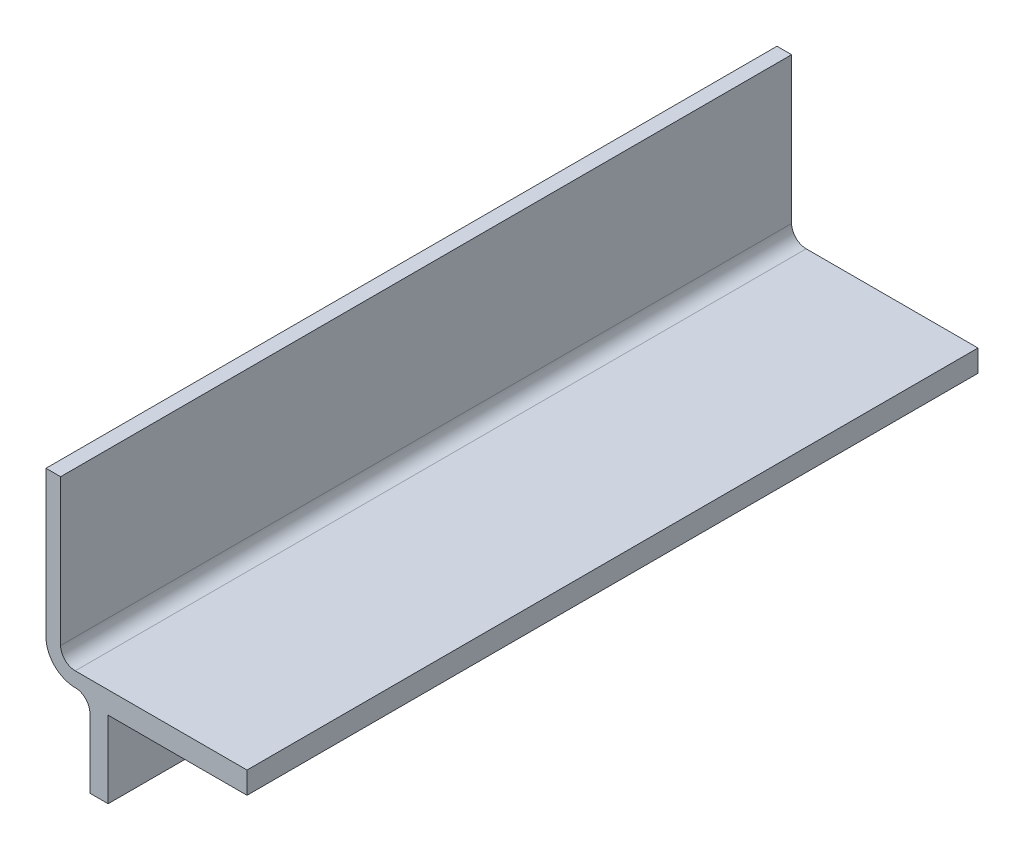
ISO-10303-21;
HEADER;
FILE_DESCRIPTION(('STEP AP214'),'2;1');
FILE_NAME('part.step','',(''),(''),'','','');
FILE_SCHEMA(('AUTOMOTIVE_DESIGN { 1 0 10303 214 1 1 1 1 }'));
ENDSEC;
DATA;
#1=APPLICATION_CONTEXT('core data for automotive mechanical design processes');
#2=APPLICATION_PROTOCOL_DEFINITION('international standard','automotive_design',2000,#1);
#3=PRODUCT_CONTEXT('',#1,'mechanical');
#4=PRODUCT('Part','Part','',(#3));
#5=PRODUCT_RELATED_PRODUCT_CATEGORY('part','',(#4));
#6=PRODUCT_DEFINITION_FORMATION('','',#4);
#7=PRODUCT_DEFINITION_CONTEXT('part definition',#1,'design');
#8=PRODUCT_DEFINITION('design','',#6,#7);
#9=PRODUCT_DEFINITION_SHAPE('','',#8);
#10=(LENGTH_UNIT() NAMED_UNIT(*) SI_UNIT(.MILLI.,.METRE.));
#11=(NAMED_UNIT(*) PLANE_ANGLE_UNIT() SI_UNIT($,.RADIAN.));
#12=(NAMED_UNIT(*) SI_UNIT($,.STERADIAN.) SOLID_ANGLE_UNIT());
#13=UNCERTAINTY_MEASURE_WITH_UNIT(LENGTH_MEASURE(1.E-05),#10,'distance_accuracy_value','');
#14=(GEOMETRIC_REPRESENTATION_CONTEXT(3) GLOBAL_UNCERTAINTY_ASSIGNED_CONTEXT((#13)) GLOBAL_UNIT_ASSIGNED_CONTEXT((#10,
#11,#12)) REPRESENTATION_CONTEXT('',''));
#15=CARTESIAN_POINT('',(0.,0.,0.));
#16=DIRECTION('',(0.,0.,1.));
#17=DIRECTION('',(1.,0.,0.));
#18=AXIS2_PLACEMENT_3D('',#15,#16,#17);
#19=CARTESIAN_POINT('',(-2.5,0.,100.));
#20=DIRECTION('',(1.,0.,0.));
#21=DIRECTION('',(0.,0.,-1.));
#22=AXIS2_PLACEMENT_3D('',#19,#20,#21);
#23=PLANE('',#22);
#24=DIRECTION('',(0.,0.,-1.));
#25=VECTOR('',#24,1.);
#26=CARTESIAN_POINT('',(-2.5,0.,100.));
#27=LINE('',#26,#25);
#28=CARTESIAN_POINT('',(-2.5,0.,83.643534003375));
#29=VERTEX_POINT('',#28);
#30=CARTESIAN_POINT('',(-2.5,0.,16.3564659966251));
#31=VERTEX_POINT('',#30);
#32=EDGE_CURVE('E147',#29,#31,#27,.T.);
#33=ORIENTED_EDGE('',*,*,#32,.F.);
#34=CARTESIAN_POINT('',(-2.5,4.5,85.));
#35=DIRECTION('',(-1.,0.,0.));
#36=DIRECTION('',(0.,0.,1.));
#37=AXIS2_PLACEMENT_3D('',#34,#35,#36);
#38=CIRCLE('',#37,4.7);
#39=CARTESIAN_POINT('',(-2.5,0.,86.3564659966251));
#40=VERTEX_POINT('',#39);
#41=EDGE_CURVE('E54',#40,#29,#38,.T.);
#42=ORIENTED_EDGE('',*,*,#41,.F.);
#43=CARTESIAN_POINT('',(-2.5,0.,100.));
#44=VERTEX_POINT('',#43);
#45=EDGE_CURVE('E145',#44,#40,#27,.T.);
#46=ORIENTED_EDGE('',*,*,#45,.F.);
#47=DIRECTION('',(0.,-1.,0.));
#48=VECTOR('',#47,1.);
#49=CARTESIAN_POINT('',(-2.5,0.,100.));
#50=LINE('',#49,#48);
#51=CARTESIAN_POINT('',(-2.5,9.5,100.));
#52=VERTEX_POINT('',#51);
#53=EDGE_CURVE('E168',#52,#44,#50,.T.);
#54=ORIENTED_EDGE('',*,*,#53,.F.);
#55=DIRECTION('',(0.,0.,-1.));
#56=VECTOR('',#55,1.);
#57=CARTESIAN_POINT('',(-2.5,9.5,0.));
#58=LINE('',#57,#56);
#59=CARTESIAN_POINT('',(-2.5,9.5,0.));
#60=VERTEX_POINT('',#59);
#61=EDGE_CURVE('E331',#52,#60,#58,.T.);
#62=ORIENTED_EDGE('',*,*,#61,.T.);
#63=DIRECTION('',(0.,-1.,0.));
#64=VECTOR('',#63,1.);
#65=CARTESIAN_POINT('',(-2.5,0.,0.));
#66=LINE('',#65,#64);
#67=CARTESIAN_POINT('',(-2.5,0.,0.));
#68=VERTEX_POINT('',#67);
#69=EDGE_CURVE('E174',#60,#68,#66,.T.);
#70=ORIENTED_EDGE('',*,*,#69,.T.);
#71=CARTESIAN_POINT('',(-2.5,0.,13.643534003375));
#72=VERTEX_POINT('',#71);
#73=EDGE_CURVE('E155',#72,#68,#27,.T.);
#74=ORIENTED_EDGE('',*,*,#73,.F.);
#75=CARTESIAN_POINT('',(-2.5,4.5,15.));
#76=DIRECTION('',(-1.,0.,0.));
#77=DIRECTION('',(0.,0.,1.));
#78=AXIS2_PLACEMENT_3D('',#75,#76,#77);
#79=CIRCLE('',#78,4.7);
#80=EDGE_CURVE('E60',#31,#72,#79,.T.);
#81=ORIENTED_EDGE('',*,*,#80,.F.);
#82=EDGE_LOOP('',(#33,#42,#46,#54,#62,#70,#74,#81));
#83=FACE_BOUND('',#82,.T.);
#84=ADVANCED_FACE('F39',(#83),#23,.F.);
#85=CARTESIAN_POINT('',(0.,10.5,100.));
#86=DIRECTION('',(-1.,0.,0.));
#87=DIRECTION('',(0.,-1.,0.));
#88=AXIS2_PLACEMENT_3D('',#85,#86,#87);
#89=PLANE('',#88);
#90=CARTESIAN_POINT('',(0.,4.5,85.));
#91=DIRECTION('',(-1.,0.,0.));
#92=DIRECTION('',(0.,-1.,0.));
#93=AXIS2_PLACEMENT_3D('',#90,#91,#92);
#94=CIRCLE('',#93,2.24999999999998);
#95=CARTESIAN_POINT('',(0.,2.25000000000002,85.));
#96=VERTEX_POINT('',#95);
#97=EDGE_CURVE('E43',#96,#96,#94,.T.);
#98=ORIENTED_EDGE('',*,*,#97,.T.);
#99=EDGE_LOOP('',(#98));
#100=FACE_BOUND('',#99,.T.);
#101=CARTESIAN_POINT('',(0.,4.5,15.));
#102=DIRECTION('',(-1.,0.,0.));
#103=DIRECTION('',(0.,-1.,0.));
#104=AXIS2_PLACEMENT_3D('',#101,#102,#103);
#105=CIRCLE('',#104,2.24999999999998);
#106=CARTESIAN_POINT('',(0.,2.25000000000002,15.));
#107=VERTEX_POINT('',#106);
#108=EDGE_CURVE('E191',#107,#107,#105,.T.);
#109=ORIENTED_EDGE('',*,*,#108,.T.);
#110=EDGE_LOOP('',(#109));
#111=FACE_BOUND('',#110,.T.);
#112=DIRECTION('',(0.,1.,0.));
#113=VECTOR('',#112,1.);
#114=CARTESIAN_POINT('',(0.,10.5,0.));
#115=LINE('',#114,#113);
#116=CARTESIAN_POINT('',(0.,0.,0.));
#117=VERTEX_POINT('',#116);
#118=CARTESIAN_POINT('',(0.,10.5,0.));
#119=VERTEX_POINT('',#118);
#120=EDGE_CURVE('E190',#117,#119,#115,.T.);
#121=ORIENTED_EDGE('',*,*,#120,.T.);
#122=DIRECTION('',(0.,0.,-1.));
#123=VECTOR('',#122,1.);
#124=CARTESIAN_POINT('',(0.,10.5,100.));
#125=LINE('',#124,#123);
#126=CARTESIAN_POINT('',(0.,10.5,100.));
#127=VERTEX_POINT('',#126);
#128=EDGE_CURVE('E334',#127,#119,#125,.T.);
#129=ORIENTED_EDGE('',*,*,#128,.F.);
#130=DIRECTION('',(0.,1.,0.));
#131=VECTOR('',#130,1.);
#132=CARTESIAN_POINT('',(0.,10.5,100.));
#133=LINE('',#132,#131);
#134=CARTESIAN_POINT('',(0.,0.,100.));
#135=VERTEX_POINT('',#134);
#136=EDGE_CURVE('E173',#135,#127,#133,.T.);
#137=ORIENTED_EDGE('',*,*,#136,.F.);
#138=DIRECTION('',(0.,0.,-1.));
#139=VECTOR('',#138,1.);
#140=CARTESIAN_POINT('',(0.,0.,100.));
#141=LINE('',#140,#139);
#142=EDGE_CURVE('E160',#135,#117,#141,.T.);
#143=ORIENTED_EDGE('',*,*,#142,.T.);
#144=EDGE_LOOP('',(#121,#129,#137,#143));
#145=FACE_BOUND('',#144,.T.);
#146=ADVANCED_FACE('F220',(#100,#111,#145),#89,.F.);
#147=CARTESIAN_POINT('',(19.,10.5,100.));
#148=DIRECTION('',(0.,1.,0.));
#149=DIRECTION('',(-1.,0.,0.));
#150=AXIS2_PLACEMENT_3D('',#147,#148,#149);
#151=PLANE('',#150);
#152=DIRECTION('',(1.,0.,0.));
#153=VECTOR('',#152,1.);
#154=CARTESIAN_POINT('',(19.,10.5,0.));
#155=LINE('',#154,#153);
#156=CARTESIAN_POINT('',(19.,10.5,0.));
#157=VERTEX_POINT('',#156);
#158=EDGE_CURVE('E188',#119,#157,#155,.T.);
#159=ORIENTED_EDGE('',*,*,#158,.T.);
#160=DIRECTION('',(0.,0.,-1.));
#161=VECTOR('',#160,1.);
#162=CARTESIAN_POINT('',(19.,10.5,100.));
#163=LINE('',#162,#161);
#164=CARTESIAN_POINT('',(19.,10.5,100.));
#165=VERTEX_POINT('',#164);
#166=EDGE_CURVE('E344',#165,#157,#163,.T.);
#167=ORIENTED_EDGE('',*,*,#166,.F.);
#168=DIRECTION('',(1.,0.,0.));
#169=VECTOR('',#168,1.);
#170=CARTESIAN_POINT('',(19.,10.5,100.));
#171=LINE('',#170,#169);
#172=EDGE_CURVE('E206',#127,#165,#171,.T.);
#173=ORIENTED_EDGE('',*,*,#172,.F.);
#174=ORIENTED_EDGE('',*,*,#128,.T.);
#175=EDGE_LOOP('',(#159,#167,#173,#174));
#176=FACE_BOUND('',#175,.T.);
#177=ADVANCED_FACE('F241',(#176),#151,.F.);
#178=CARTESIAN_POINT('',(19.,13.5,100.));
#179=DIRECTION('',(-1.,0.,0.));
#180=DIRECTION('',(0.,-1.,0.));
#181=AXIS2_PLACEMENT_3D('',#178,#179,#180);
#182=PLANE('',#181);
#183=DIRECTION('',(0.,1.,0.));
#184=VECTOR('',#183,1.);
#185=CARTESIAN_POINT('',(19.,13.5,0.));
#186=LINE('',#185,#184);
#187=CARTESIAN_POINT('',(19.,13.5,0.));
#188=VERTEX_POINT('',#187);
#189=EDGE_CURVE('E186',#157,#188,#186,.T.);
#190=ORIENTED_EDGE('',*,*,#189,.T.);
#191=DIRECTION('',(0.,0.,-1.));
#192=VECTOR('',#191,1.);
#193=CARTESIAN_POINT('',(19.,13.5,100.));
#194=LINE('',#193,#192);
#195=CARTESIAN_POINT('',(19.,13.5,100.));
#196=VERTEX_POINT('',#195);
#197=EDGE_CURVE('E346',#196,#188,#194,.T.);
#198=ORIENTED_EDGE('',*,*,#197,.F.);
#199=DIRECTION('',(0.,1.,0.));
#200=VECTOR('',#199,1.);
#201=CARTESIAN_POINT('',(19.,13.5,100.));
#202=LINE('',#201,#200);
#203=EDGE_CURVE('E204',#165,#196,#202,.T.);
#204=ORIENTED_EDGE('',*,*,#203,.F.);
#205=ORIENTED_EDGE('',*,*,#166,.T.);
#206=EDGE_LOOP('',(#190,#198,#204,#205));
#207=FACE_BOUND('',#206,.T.);
#208=ADVANCED_FACE('F262',(#207),#182,.F.);
#209=CARTESIAN_POINT('',(-6.5,13.5,100.));
#210=DIRECTION('',(0.,-1.,0.));
#211=DIRECTION('',(0.,0.,-1.));
#212=AXIS2_PLACEMENT_3D('',#209,#210,#211);
#213=PLANE('',#212);
#214=DIRECTION('',(-1.,0.,0.));
#215=VECTOR('',#214,1.);
#216=CARTESIAN_POINT('',(-6.5,13.5,0.));
#217=LINE('',#216,#215);
#218=CARTESIAN_POINT('',(-4.5,13.5,0.));
#219=VERTEX_POINT('',#218);
#220=EDGE_CURVE('E183',#188,#219,#217,.T.);
#221=ORIENTED_EDGE('',*,*,#220,.T.);
#222=DIRECTION('',(0.,0.,-1.));
#223=VECTOR('',#222,1.);
#224=CARTESIAN_POINT('',(-4.5,13.5,100.));
#225=LINE('',#224,#223);
#226=CARTESIAN_POINT('',(-4.5,13.5,100.));
#227=VERTEX_POINT('',#226);
#228=EDGE_CURVE('E285',#219,#227,#225,.F.);
#229=ORIENTED_EDGE('',*,*,#228,.T.);
#230=DIRECTION('',(-1.,0.,0.));
#231=VECTOR('',#230,1.);
#232=CARTESIAN_POINT('',(-6.5,13.5,100.));
#233=LINE('',#232,#231);
#234=EDGE_CURVE('E201',#196,#227,#233,.T.);
#235=ORIENTED_EDGE('',*,*,#234,.F.);
#236=ORIENTED_EDGE('',*,*,#197,.T.);
#237=EDGE_LOOP('',(#221,#229,#235,#236));
#238=FACE_BOUND('',#237,.T.);
#239=ADVANCED_FACE('F258',(#238),#213,.F.);
#240=CARTESIAN_POINT('',(-6.5,35.5,100.));
#241=DIRECTION('',(-1.,0.,0.));
#242=DIRECTION('',(0.,-1.,0.));
#243=AXIS2_PLACEMENT_3D('',#240,#241,#242);
#244=PLANE('',#243);
#245=DIRECTION('',(0.,1.,0.));
#246=VECTOR('',#245,1.);
#247=CARTESIAN_POINT('',(-6.5,35.5,100.));
#248=LINE('',#247,#246);
#249=CARTESIAN_POINT('',(-6.5,15.5,100.));
#250=VERTEX_POINT('',#249);
#251=CARTESIAN_POINT('',(-6.5,35.5,100.));
#252=VERTEX_POINT('',#251);
#253=EDGE_CURVE('E199',#250,#252,#248,.T.);
#254=ORIENTED_EDGE('',*,*,#253,.F.);
#255=DIRECTION('',(0.,0.,-1.));
#256=VECTOR('',#255,1.);
#257=CARTESIAN_POINT('',(-6.5,15.5,0.));
#258=LINE('',#257,#256);
#259=CARTESIAN_POINT('',(-6.5,15.5,0.));
#260=VERTEX_POINT('',#259);
#261=EDGE_CURVE('E287',#250,#260,#258,.T.);
#262=ORIENTED_EDGE('',*,*,#261,.T.);
#263=DIRECTION('',(0.,1.,0.));
#264=VECTOR('',#263,1.);
#265=CARTESIAN_POINT('',(-6.5,35.5,0.));
#266=LINE('',#265,#264);
#267=CARTESIAN_POINT('',(-6.5,35.5,0.));
#268=VERTEX_POINT('',#267);
#269=EDGE_CURVE('E181',#260,#268,#266,.T.);
#270=ORIENTED_EDGE('',*,*,#269,.T.);
#271=DIRECTION('',(0.,0.,-1.));
#272=VECTOR('',#271,1.);
#273=CARTESIAN_POINT('',(-6.5,35.5,100.));
#274=LINE('',#273,#272);
#275=EDGE_CURVE('E157',#252,#268,#274,.T.);
#276=ORIENTED_EDGE('',*,*,#275,.F.);
#277=EDGE_LOOP('',(#254,#262,#270,#276));
#278=FACE_BOUND('',#277,.T.);
#279=ADVANCED_FACE('F254',(#278),#244,.F.);
#280=CARTESIAN_POINT('',(-8.5,35.5,100.));
#281=DIRECTION('',(0.,-1.,0.));
#282=DIRECTION('',(1.,0.,0.));
#283=AXIS2_PLACEMENT_3D('',#280,#281,#282);
#284=PLANE('',#283);
#285=DIRECTION('',(-1.,0.,0.));
#286=VECTOR('',#285,1.);
#287=CARTESIAN_POINT('',(-8.5,35.5,0.));
#288=LINE('',#287,#286);
#289=CARTESIAN_POINT('',(-8.5,35.5,0.));
#290=VERTEX_POINT('',#289);
#291=EDGE_CURVE('E179',#268,#290,#288,.T.);
#292=ORIENTED_EDGE('',*,*,#291,.T.);
#293=DIRECTION('',(0.,0.,-1.));
#294=VECTOR('',#293,1.);
#295=CARTESIAN_POINT('',(-8.5,35.5,100.));
#296=LINE('',#295,#294);
#297=CARTESIAN_POINT('',(-8.5,35.5,100.));
#298=VERTEX_POINT('',#297);
#299=EDGE_CURVE('E153',#298,#290,#296,.T.);
#300=ORIENTED_EDGE('',*,*,#299,.F.);
#301=DIRECTION('',(-1.,0.,0.));
#302=VECTOR('',#301,1.);
#303=CARTESIAN_POINT('',(-8.5,35.5,100.));
#304=LINE('',#303,#302);
#305=EDGE_CURVE('E197',#252,#298,#304,.T.);
#306=ORIENTED_EDGE('',*,*,#305,.F.);
#307=ORIENTED_EDGE('',*,*,#275,.T.);
#308=EDGE_LOOP('',(#292,#300,#306,#307));
#309=FACE_BOUND('',#308,.T.);
#310=ADVANCED_FACE('F250',(#309),#284,.F.);
#311=CARTESIAN_POINT('',(-8.5,11.5,100.));
#312=DIRECTION('',(1.,0.,0.));
#313=DIRECTION('',(0.,0.,-1.));
#314=AXIS2_PLACEMENT_3D('',#311,#312,#313);
#315=PLANE('',#314);
#316=DIRECTION('',(0.,-1.,0.));
#317=VECTOR('',#316,1.);
#318=CARTESIAN_POINT('',(-8.5,11.5,0.));
#319=LINE('',#318,#317);
#320=CARTESIAN_POINT('',(-8.5,15.5,0.));
#321=VERTEX_POINT('',#320);
#322=EDGE_CURVE('E176',#290,#321,#319,.T.);
#323=ORIENTED_EDGE('',*,*,#322,.T.);
#324=DIRECTION('',(0.,0.,-1.));
#325=VECTOR('',#324,1.);
#326=CARTESIAN_POINT('',(-8.5,15.5,100.));
#327=LINE('',#326,#325);
#328=CARTESIAN_POINT('',(-8.5,15.5,100.));
#329=VERTEX_POINT('',#328);
#330=EDGE_CURVE('E293',#321,#329,#327,.F.);
#331=ORIENTED_EDGE('',*,*,#330,.T.);
#332=DIRECTION('',(0.,-1.,0.));
#333=VECTOR('',#332,1.);
#334=CARTESIAN_POINT('',(-8.5,11.5,100.));
#335=LINE('',#334,#333);
#336=EDGE_CURVE('E194',#298,#329,#335,.T.);
#337=ORIENTED_EDGE('',*,*,#336,.F.);
#338=ORIENTED_EDGE('',*,*,#299,.T.);
#339=EDGE_LOOP('',(#323,#331,#337,#338));
#340=FACE_BOUND('',#339,.T.);
#341=ADVANCED_FACE('F247',(#340),#315,.F.);
#342=CARTESIAN_POINT('',(0.,0.,100.));
#343=DIRECTION('',(0.,1.,0.));
#344=DIRECTION('',(-1.,0.,0.));
#345=AXIS2_PLACEMENT_3D('',#342,#343,#344);
#346=PLANE('',#345);
#347=ORIENTED_EDGE('',*,*,#45,.T.);
#348=CARTESIAN_POINT('',(-8.79185078042655,0.,74.9715014294679));
#349=CARTESIAN_POINT('',(-8.59549709802991,0.,75.1867398428544));
#350=CARTESIAN_POINT('',(-8.39969828391984,0.,75.4024878233955));
#351=CARTESIAN_POINT('',(-8.00948926559515,0.,75.8352552097265));
#352=CARTESIAN_POINT('',(-7.81507913238473,0.,76.0522746795102));
#353=CARTESIAN_POINT('',(-7.42749354108288,0.,76.4883249532876));
#354=CARTESIAN_POINT('',(-7.23432203508225,0.,76.7073592747664));
#355=CARTESIAN_POINT('',(-6.85008462733779,0.,77.1472609011786));
#356=CARTESIAN_POINT('',(-6.65901868030493,0.,77.3681281665068));
#357=CARTESIAN_POINT('',(-6.26222627478328,0.,77.8323569351145));
#358=CARTESIAN_POINT('',(-6.05675106155279,0.,78.0759336518355));
#359=CARTESIAN_POINT('',(-5.64991328370215,0.,78.5664978443261));
#360=CARTESIAN_POINT('',(-5.44855060183272,0.,78.8134852225195));
#361=CARTESIAN_POINT('',(-5.05156551755478,0.,79.3116059205758));
#362=CARTESIAN_POINT('',(-4.85593712338084,0.,79.5627344507924));
#363=CARTESIAN_POINT('',(-4.47230784959871,0.,80.0707468451907));
#364=CARTESIAN_POINT('',(-4.28430575318498,0.,80.3276297810013));
#365=CARTESIAN_POINT('',(-4.01021541330674,0.,80.7191792921482));
#366=CARTESIAN_POINT('',(-3.92001978164948,0.,80.8509696140033));
#367=CARTESIAN_POINT('',(-3.74301261646748,0.,81.1167984025877));
#368=CARTESIAN_POINT('',(-3.65620083526796,0.,81.2508367037492));
#369=CARTESIAN_POINT('',(-3.48658500896857,0.,81.5217221779956));
#370=CARTESIAN_POINT('',(-3.40378731062747,0.,81.6585733414529));
#371=CARTESIAN_POINT('',(-3.24333291170787,0.,81.9352682771725));
#372=CARTESIAN_POINT('',(-3.16567604509538,0.,82.0751119525919));
#373=CARTESIAN_POINT('',(-3.01844678093927,0.,82.3549990543041));
#374=CARTESIAN_POINT('',(-2.94873155859704,0.,82.4949668529556));
#375=CARTESIAN_POINT('',(-2.81690248142525,0.,82.7785000161987));
#376=CARTESIAN_POINT('',(-2.75478994460935,0.,82.9220659993945));
#377=CARTESIAN_POINT('',(-2.64017292250554,0.,83.2125365098875));
#378=CARTESIAN_POINT('',(-2.58764087626724,0.,83.3594300487034));
#379=CARTESIAN_POINT('',(-2.49407515879616,0.,83.656790631917));
#380=CARTESIAN_POINT('',(-2.45303352270173,0.,83.8072551221504));
#381=CARTESIAN_POINT('',(-2.39364675150553,0.,84.0708015746565));
#382=CARTESIAN_POINT('',(-2.37216823724247,0.,84.1831784481746));
#383=CARTESIAN_POINT('',(-2.33724462101246,0.,84.4091985123379));
#384=CARTESIAN_POINT('',(-2.3238000164093,0.,84.5228417809396));
#385=CARTESIAN_POINT('',(-2.30546856761926,0.,84.7507346677607));
#386=CARTESIAN_POINT('',(-2.30057505735846,0.,84.8649837439602));
#387=CARTESIAN_POINT('',(-2.2995205899798,0.,85.0935233475531));
#388=CARTESIAN_POINT('',(-2.30335989887292,0.,85.2078138761032));
#389=CARTESIAN_POINT('',(-2.32082190211359,0.,85.4525915735153));
#390=CARTESIAN_POINT('',(-2.33580343937033,0.,85.5829825847578));
#391=CARTESIAN_POINT('',(-2.37632474429003,0.,85.842106900782));
#392=CARTESIAN_POINT('',(-2.40186625626016,0.,85.9708399280722));
#393=CARTESIAN_POINT('',(-2.462477756132,0.,86.226447079586));
#394=CARTESIAN_POINT('',(-2.49757760100143,0.,86.3533140436198));
#395=CARTESIAN_POINT('',(-2.57598391581281,0.,86.6044499457751));
#396=CARTESIAN_POINT('',(-2.61929007592269,0.,86.7287189817854));
#397=CARTESIAN_POINT('',(-2.72822193240367,0.,87.0149950432115));
#398=CARTESIAN_POINT('',(-2.7965060047415,0.,87.1759865096628));
#399=CARTESIAN_POINT('',(-2.94275226060472,0.,87.4935486050954));
#400=CARTESIAN_POINT('',(-3.02071954578856,0.,87.6501168499015));
#401=CARTESIAN_POINT('',(-3.18437785081189,0.,87.9595258165839));
#402=CARTESIAN_POINT('',(-3.27008372580672,0.,88.1123586215876));
#403=CARTESIAN_POINT('',(-3.44744821679956,0.,88.4144718877698));
#404=CARTESIAN_POINT('',(-3.5391058390228,0.,88.5637529363332));
#405=CARTESIAN_POINT('',(-3.72851348810331,0.,88.8614301169743));
#406=CARTESIAN_POINT('',(-3.82633250942564,0.,89.0097821442232));
#407=CARTESIAN_POINT('',(-4.02586427480941,0.,89.3038407749507));
#408=CARTESIAN_POINT('',(-4.12757714510346,0.,89.4495472924398));
#409=CARTESIAN_POINT('',(-4.33402471535539,0.,89.7385320737766));
#410=CARTESIAN_POINT('',(-4.43875562756289,0.,89.8818130513095));
#411=CARTESIAN_POINT('',(-4.65078211904138,0.,90.1664519048416));
#412=CARTESIAN_POINT('',(-4.75807760438552,0.,90.3078098509746));
#413=CARTESIAN_POINT('',(-4.99132339109442,0.,90.6103281547887));
#414=CARTESIAN_POINT('',(-5.11762232127068,0.,90.7712193672601));
#415=CARTESIAN_POINT('',(-5.37251965552156,0.,91.0911719636711));
#416=CARTESIAN_POINT('',(-5.50111811768758,0.,91.2502333012165));
#417=CARTESIAN_POINT('',(-5.88976080669608,0.,91.7251393749108));
#418=CARTESIAN_POINT('',(-6.15262734432949,0.,92.0386741078686));
#419=CARTESIAN_POINT('',(-6.68370757173957,0.,92.6613681110348));
#420=CARTESIAN_POINT('',(-6.95192331520413,0.,92.9705256196826));
#421=CARTESIAN_POINT('',(-7.49219947464104,0.,93.5854691774912));
#422=CARTESIAN_POINT('',(-7.76425997427142,0.,93.8912551530322));
#423=CARTESIAN_POINT('',(-8.31179570823049,0.,94.5008316308653));
#424=CARTESIAN_POINT('',(-8.58727658365768,0.,94.8046170563407));
#425=CARTESIAN_POINT('',(-9.14046740002368,0.,95.4101561011151));
#426=CARTESIAN_POINT('',(-9.41817736822419,0.,95.7119096954815));
#427=CARTESIAN_POINT('',(-9.97527649891679,0.,96.3137218965558));
#428=CARTESIAN_POINT('',(-10.2546652261788,0.,96.613780906515));
#429=CARTESIAN_POINT('',(-10.814843782006,0.,97.2125887103189));
#430=CARTESIAN_POINT('',(-11.0956336141647,0.,97.5113375007992));
#431=CARTESIAN_POINT('',(-11.8750001563827,0.,98.3374053639268));
#432=CARTESIAN_POINT('',(-12.3747835385772,0.,98.8635857613828));
#433=CARTESIAN_POINT('',(-13.3769122987331,0.,99.9135711840606));
#434=CARTESIAN_POINT('',(-13.8792578615163,0.,100.437376032624));
#435=CARTESIAN_POINT('',(-14.8841105638082,0.,101.481411615299));
#436=CARTESIAN_POINT('',(-15.3866113728565,0.,102.001648446099));
#437=CARTESIAN_POINT('',(-16.3930108062511,0.,103.040683969647));
#438=CARTESIAN_POINT('',(-16.8969093096174,0.,103.559482779543));
#439=CARTESIAN_POINT('',(-17.4013196340581,0.,104.077781092059));
#440=B_SPLINE_CURVE_WITH_KNOTS('',3,(#348,#349,#350,#351,#352,#353,#354,#355,#356,#357,#358,
#359,#360,#361,#362,#363,#364,#365,#366,#367,#368,#369,#370,#371,#372,#373,#374,#375,#376,#377,
#378,#379,#380,#381,#382,#383,#384,#385,#386,#387,#388,#389,#390,#391,#392,#393,#394,#395,#396,
#397,#398,#399,#400,#401,#402,#403,#404,#405,#406,#407,#408,#409,#410,#411,#412,#413,#414,#415,
#416,#417,#418,#419,#420,#421,#422,#423,#424,#425,#426,#427,#428,#429,#430,#431,#432,#433,#434,
#435,#436,#437,#438,#439),.UNSPECIFIED.,.F.,.F.,(4,2,2,2,2,2,2,2,2,2,2,2,2,2,2,2,2,2,2,2,2,2,2,
2,2,2,2,2,2,2,2,2,2,2,2,2,2,2,2,2,2,2,2,2,2,4),(0.,0.874039982988999,1.74812434086079,
2.62425341980132,3.50036361692257,4.45633618245894,5.41228145483098,6.36718941637795,
7.32194441450498,7.80100287324061,8.28002620207038,8.75978374857137,9.23952579272384,
9.70844873953403,10.1774528647789,10.6450857205834,11.1123936179949,11.4553694086585,
11.7983664300902,12.1410959459683,12.483835901893,12.877103160781,13.270435405917,
13.6650106662358,14.059571032206,14.5837654780934,15.1082372799406,15.633738188698,
16.1591515780587,16.6921720877749,17.2252098918542,17.7576055883496,18.2899818157733,
18.9035809664486,19.5171956399918,20.7445469117616,21.9723788271463,23.200237500179,
24.4304993085992,25.6607761860614,26.8907467974448,28.120720565238,30.2978253199902,
32.4750894052207,34.6449666414905,36.8146615819819),.UNSPECIFIED.);
#441=EDGE_CURVE('E11',#40,#29,#440,.F.);
#442=ORIENTED_EDGE('',*,*,#441,.T.);
#443=ORIENTED_EDGE('',*,*,#32,.T.);
#444=CARTESIAN_POINT('',(-8.79185078042657,0.,4.97150142946791));
#445=CARTESIAN_POINT('',(-8.59549709802993,0.,5.1867398428544));
#446=CARTESIAN_POINT('',(-8.39969828391987,0.,5.40248782339551));
#447=CARTESIAN_POINT('',(-8.00948926559517,0.,5.83525520972642));
#448=CARTESIAN_POINT('',(-7.81507913238475,0.,6.05227467951019));
#449=CARTESIAN_POINT('',(-7.42749354108289,0.,6.48832495328755));
#450=CARTESIAN_POINT('',(-7.23432203508227,0.,6.7073592747664));
#451=CARTESIAN_POINT('',(-6.85008462733781,0.,7.14726090117856));
#452=CARTESIAN_POINT('',(-6.65901868030494,0.,7.36812816650675));
#453=CARTESIAN_POINT('',(-6.26222627478329,0.,7.83235693511451));
#454=CARTESIAN_POINT('',(-6.0567510615528,0.,8.07593365183548));
#455=CARTESIAN_POINT('',(-5.64991328370215,0.,8.56649784432611));
#456=CARTESIAN_POINT('',(-5.44855060183273,0.,8.81348522251954));
#457=CARTESIAN_POINT('',(-5.05156551755479,0.,9.31160592057578));
#458=CARTESIAN_POINT('',(-4.85593712338085,0.,9.56273445079242));
#459=CARTESIAN_POINT('',(-4.47230784959872,0.,10.0707468451907));
#460=CARTESIAN_POINT('',(-4.284305753185,0.,10.3276297810013));
#461=CARTESIAN_POINT('',(-4.01021541330675,0.,10.7191792921482));
#462=CARTESIAN_POINT('',(-3.92001978164949,0.,10.8509696140033));
#463=CARTESIAN_POINT('',(-3.74301261646749,0.,11.1167984025876));
#464=CARTESIAN_POINT('',(-3.65620083526797,0.,11.2508367037492));
#465=CARTESIAN_POINT('',(-3.48658500896858,0.,11.5217221779956));
#466=CARTESIAN_POINT('',(-3.40378731062748,0.,11.6585733414529));
#467=CARTESIAN_POINT('',(-3.24333291170788,0.,11.9352682771724));
#468=CARTESIAN_POINT('',(-3.16567604509539,0.,12.0751119525919));
#469=CARTESIAN_POINT('',(-3.01844678093928,0.,12.354999054304));
#470=CARTESIAN_POINT('',(-2.94873155859705,0.,12.4949668529556));
#471=CARTESIAN_POINT('',(-2.81690248142526,0.,12.7785000161987));
#472=CARTESIAN_POINT('',(-2.75478994460936,0.,12.9220659993945));
#473=CARTESIAN_POINT('',(-2.64017292250555,0.,13.2125365098875));
#474=CARTESIAN_POINT('',(-2.58764087626725,0.,13.3594300487034));
#475=CARTESIAN_POINT('',(-2.49407515879616,0.,13.656790631917));
#476=CARTESIAN_POINT('',(-2.45303352270173,0.,13.8072551221504));
#477=CARTESIAN_POINT('',(-2.39364675150553,0.,14.0708015746565));
#478=CARTESIAN_POINT('',(-2.37216823724248,0.,14.1831784481746));
#479=CARTESIAN_POINT('',(-2.33724462101246,0.,14.4091985123379));
#480=CARTESIAN_POINT('',(-2.3238000164093,0.,14.5228417809396));
#481=CARTESIAN_POINT('',(-2.30546856761926,0.,14.7507346677607));
#482=CARTESIAN_POINT('',(-2.30057505735846,0.,14.8649837439601));
#483=CARTESIAN_POINT('',(-2.2995205899798,0.,15.0935233475531));
#484=CARTESIAN_POINT('',(-2.30335989887292,0.,15.2078138761032));
#485=CARTESIAN_POINT('',(-2.32082190211359,0.,15.4525915735153));
#486=CARTESIAN_POINT('',(-2.33580343937032,0.,15.5829825847577));
#487=CARTESIAN_POINT('',(-2.37632474429002,0.,15.842106900782));
#488=CARTESIAN_POINT('',(-2.40186625626015,0.,15.9708399280722));
#489=CARTESIAN_POINT('',(-2.46247775613199,0.,16.2264470795859));
#490=CARTESIAN_POINT('',(-2.49757760100143,0.,16.3533140436198));
#491=CARTESIAN_POINT('',(-2.57598391581281,0.,16.6044499457751));
#492=CARTESIAN_POINT('',(-2.61929007592268,0.,16.7287189817854));
#493=CARTESIAN_POINT('',(-2.72822193240366,0.,17.0149950432115));
#494=CARTESIAN_POINT('',(-2.7965060047415,0.,17.1759865096628));
#495=CARTESIAN_POINT('',(-2.94275226060471,0.,17.4935486050954));
#496=CARTESIAN_POINT('',(-3.02071954578855,0.,17.6501168499015));
#497=CARTESIAN_POINT('',(-3.18437785081187,0.,17.9595258165839));
#498=CARTESIAN_POINT('',(-3.27008372580671,0.,18.1123586215876));
#499=CARTESIAN_POINT('',(-3.44744821679955,0.,18.4144718877698));
#500=CARTESIAN_POINT('',(-3.53910583902279,0.,18.5637529363331));
#501=CARTESIAN_POINT('',(-3.72851348810331,0.,18.8614301169743));
#502=CARTESIAN_POINT('',(-3.82633250942564,0.,19.0097821442232));
#503=CARTESIAN_POINT('',(-4.02586427480941,0.,19.3038407749507));
#504=CARTESIAN_POINT('',(-4.12757714510345,0.,19.4495472924397));
#505=CARTESIAN_POINT('',(-4.33402471535539,0.,19.7385320737766));
#506=CARTESIAN_POINT('',(-4.43875562756288,0.,19.8818130513095));
#507=CARTESIAN_POINT('',(-4.65078211904137,0.,20.1664519048416));
#508=CARTESIAN_POINT('',(-4.75807760438551,0.,20.3078098509746));
#509=CARTESIAN_POINT('',(-4.99132339109441,0.,20.6103281547887));
#510=CARTESIAN_POINT('',(-5.11762232127067,0.,20.7712193672601));
#511=CARTESIAN_POINT('',(-5.37251965552156,0.,21.0911719636711));
#512=CARTESIAN_POINT('',(-5.50111811768758,0.,21.2502333012165));
#513=CARTESIAN_POINT('',(-5.88976080669607,0.,21.7251393749107));
#514=CARTESIAN_POINT('',(-6.15262734432948,0.,22.0386741078686));
#515=CARTESIAN_POINT('',(-6.68370757173956,0.,22.6613681110347));
#516=CARTESIAN_POINT('',(-6.95192331520412,0.,22.9705256196826));
#517=CARTESIAN_POINT('',(-7.49219947464104,0.,23.5854691774912));
#518=CARTESIAN_POINT('',(-7.76425997427141,0.,23.8912551530322));
#519=CARTESIAN_POINT('',(-8.31179570823049,0.,24.5008316308653));
#520=CARTESIAN_POINT('',(-8.58727658365768,0.,24.8046170563407));
#521=CARTESIAN_POINT('',(-9.14046740002368,0.,25.4101561011151));
#522=CARTESIAN_POINT('',(-9.41817736822419,0.,25.7119096954815));
#523=CARTESIAN_POINT('',(-9.97527649891679,0.,26.3137218965558));
#524=CARTESIAN_POINT('',(-10.2546652261788,0.,26.613780906515));
#525=CARTESIAN_POINT('',(-10.814843782006,0.,27.2125887103189));
#526=CARTESIAN_POINT('',(-11.0956336141647,0.,27.5113375007992));
#527=CARTESIAN_POINT('',(-11.8750001563828,0.,28.3374053639268));
#528=CARTESIAN_POINT('',(-12.3747835385772,0.,28.8635857613828));
#529=CARTESIAN_POINT('',(-13.3769122987331,0.,29.9135711840605));
#530=CARTESIAN_POINT('',(-13.8792578615163,0.,30.4373760326235));
#531=CARTESIAN_POINT('',(-14.8841105638082,0.,31.4814116152989));
#532=CARTESIAN_POINT('',(-15.3866113728565,0.,32.0016484460995));
#533=CARTESIAN_POINT('',(-16.3930108062511,0.,33.0406839696468));
#534=CARTESIAN_POINT('',(-16.8969093096174,0.,33.5594827795426));
#535=CARTESIAN_POINT('',(-17.401319634058,0.,34.0777810920586));
#536=B_SPLINE_CURVE_WITH_KNOTS('',3,(#444,#445,#446,#447,#448,#449,#450,#451,#452,#453,#454,
#455,#456,#457,#458,#459,#460,#461,#462,#463,#464,#465,#466,#467,#468,#469,#470,#471,#472,#473,
#474,#475,#476,#477,#478,#479,#480,#481,#482,#483,#484,#485,#486,#487,#488,#489,#490,#491,#492,
#493,#494,#495,#496,#497,#498,#499,#500,#501,#502,#503,#504,#505,#506,#507,#508,#509,#510,#511,
#512,#513,#514,#515,#516,#517,#518,#519,#520,#521,#522,#523,#524,#525,#526,#527,#528,#529,#530,
#531,#532,#533,#534,#535),.UNSPECIFIED.,.F.,.F.,(4,2,2,2,2,2,2,2,2,2,2,2,2,2,2,2,2,2,2,2,2,2,2,
2,2,2,2,2,2,2,2,2,2,2,2,2,2,2,2,2,2,2,2,2,2,4),(0.,0.874039982989007,1.74812434086081,
2.62425341980133,3.50036361692259,4.45633618245897,5.41228145483101,6.36718941637797,
7.321944414505,7.80100287324063,8.28002620207038,8.75978374857137,9.23952579272385,
9.70844873953404,10.1774528647789,10.6450857205834,11.112393617995,11.4553694086585,
11.7983664300902,12.1410959459683,12.483835901893,12.877103160781,13.270435405917,
13.6650106662359,14.0595710322061,14.5837654780934,15.1082372799407,15.633738188698,
16.1591515780587,16.6921720877749,17.2252098918542,17.7576055883497,18.2899818157733,
18.9035809664487,19.5171956399918,20.7445469117616,21.9723788271463,23.200237500179,
24.4304993085992,25.6607761860615,26.8907467974448,28.120720565238,30.2978253199902,
32.4750894052208,34.6449666414906,36.814661581982),.UNSPECIFIED.);
#537=EDGE_CURVE('E48',#31,#72,#536,.F.);
#538=ORIENTED_EDGE('',*,*,#537,.T.);
#539=ORIENTED_EDGE('',*,*,#73,.T.);
#540=DIRECTION('',(1.,0.,0.));
#541=VECTOR('',#540,1.);
#542=CARTESIAN_POINT('',(0.,0.,0.));
#543=LINE('',#542,#541);
#544=EDGE_CURVE('E171',#68,#117,#543,.T.);
#545=ORIENTED_EDGE('',*,*,#544,.T.);
#546=ORIENTED_EDGE('',*,*,#142,.F.);
#547=DIRECTION('',(1.,0.,0.));
#548=VECTOR('',#547,1.);
#549=CARTESIAN_POINT('',(0.,0.,100.));
#550=LINE('',#549,#548);
#551=EDGE_CURVE('E152',#44,#135,#550,.T.);
#552=ORIENTED_EDGE('',*,*,#551,.F.);
#553=EDGE_LOOP('',(#347,#442,#443,#538,#539,#545,#546,#552));
#554=FACE_BOUND('',#553,.T.);
#555=ADVANCED_FACE('F150',(#554),#346,.F.);
#556=CARTESIAN_POINT('',(0.,0.,100.));
#557=DIRECTION('',(0.,0.,-1.));
#558=DIRECTION('',(-1.,0.,0.));
#559=AXIS2_PLACEMENT_3D('',#556,#557,#558);
#560=PLANE('',#559);
#561=ORIENTED_EDGE('',*,*,#336,.T.);
#562=CARTESIAN_POINT('',(-4.5,15.5,100.));
#563=DIRECTION('',(0.,0.,-1.));
#564=DIRECTION('',(-1.,0.,0.));
#565=AXIS2_PLACEMENT_3D('',#562,#563,#564);
#566=CIRCLE('',#565,4.);
#567=CARTESIAN_POINT('',(-4.5,11.5,100.));
#568=VERTEX_POINT('',#567);
#569=EDGE_CURVE('E300',#329,#568,#566,.F.);
#570=ORIENTED_EDGE('',*,*,#569,.T.);
#571=CARTESIAN_POINT('',(-4.5,9.5,100.));
#572=DIRECTION('',(0.,0.,-1.));
#573=DIRECTION('',(-1.,0.,0.));
#574=AXIS2_PLACEMENT_3D('',#571,#572,#573);
#575=CIRCLE('',#574,2.);
#576=EDGE_CURVE('E295',#568,#52,#575,.T.);
#577=ORIENTED_EDGE('',*,*,#576,.T.);
#578=ORIENTED_EDGE('',*,*,#53,.T.);
#579=ORIENTED_EDGE('',*,*,#551,.T.);
#580=ORIENTED_EDGE('',*,*,#136,.T.);
#581=ORIENTED_EDGE('',*,*,#172,.T.);
#582=ORIENTED_EDGE('',*,*,#203,.T.);
#583=ORIENTED_EDGE('',*,*,#234,.T.);
#584=CARTESIAN_POINT('',(-4.5,15.5,100.));
#585=DIRECTION('',(0.,0.,-1.));
#586=DIRECTION('',(-1.,0.,0.));
#587=AXIS2_PLACEMENT_3D('',#584,#585,#586);
#588=CIRCLE('',#587,2.);
#589=EDGE_CURVE('E284',#227,#250,#588,.T.);
#590=ORIENTED_EDGE('',*,*,#589,.T.);
#591=ORIENTED_EDGE('',*,*,#253,.T.);
#592=ORIENTED_EDGE('',*,*,#305,.T.);
#593=EDGE_LOOP('',(#561,#570,#577,#578,#579,#580,#581,#582,#583,#590,#591,#592));
#594=FACE_BOUND('',#593,.T.);
#595=ADVANCED_FACE('F312',(#594),#560,.F.);
#596=CARTESIAN_POINT('',(0.,0.,0.));
#597=DIRECTION('',(0.,0.,-1.));
#598=DIRECTION('',(-1.,0.,0.));
#599=AXIS2_PLACEMENT_3D('',#596,#597,#598);
#600=PLANE('',#599);
#601=CARTESIAN_POINT('',(-4.5,9.5,0.));
#602=DIRECTION('',(0.,0.,-1.));
#603=DIRECTION('',(-1.,0.,0.));
#604=AXIS2_PLACEMENT_3D('',#601,#602,#603);
#605=CIRCLE('',#604,2.);
#606=CARTESIAN_POINT('',(-4.5,11.5,0.));
#607=VERTEX_POINT('',#606);
#608=EDGE_CURVE('E320',#60,#607,#605,.F.);
#609=ORIENTED_EDGE('',*,*,#608,.T.);
#610=CARTESIAN_POINT('',(-4.5,15.5,0.));
#611=DIRECTION('',(0.,0.,-1.));
#612=DIRECTION('',(-1.,0.,0.));
#613=AXIS2_PLACEMENT_3D('',#610,#611,#612);
#614=CIRCLE('',#613,4.);
#615=EDGE_CURVE('E290',#607,#321,#614,.T.);
#616=ORIENTED_EDGE('',*,*,#615,.T.);
#617=ORIENTED_EDGE('',*,*,#322,.F.);
#618=ORIENTED_EDGE('',*,*,#291,.F.);
#619=ORIENTED_EDGE('',*,*,#269,.F.);
#620=CARTESIAN_POINT('',(-4.5,15.5,0.));
#621=DIRECTION('',(0.,0.,-1.));
#622=DIRECTION('',(-1.,0.,0.));
#623=AXIS2_PLACEMENT_3D('',#620,#621,#622);
#624=CIRCLE('',#623,2.);
#625=EDGE_CURVE('E291',#260,#219,#624,.F.);
#626=ORIENTED_EDGE('',*,*,#625,.T.);
#627=ORIENTED_EDGE('',*,*,#220,.F.);
#628=ORIENTED_EDGE('',*,*,#189,.F.);
#629=ORIENTED_EDGE('',*,*,#158,.F.);
#630=ORIENTED_EDGE('',*,*,#120,.F.);
#631=ORIENTED_EDGE('',*,*,#544,.F.);
#632=ORIENTED_EDGE('',*,*,#69,.F.);
#633=EDGE_LOOP('',(#609,#616,#617,#618,#619,#626,#627,#628,#629,#630,#631,#632));
#634=FACE_BOUND('',#633,.T.);
#635=ADVANCED_FACE('F273',(#634),#600,.T.);
#636=CARTESIAN_POINT('',(-4.5,9.5,100.));
#637=DIRECTION('',(0.,0.,1.));
#638=DIRECTION('',(1.,0.,0.));
#639=AXIS2_PLACEMENT_3D('',#636,#637,#638);
#640=CYLINDRICAL_SURFACE('',#639,2.);
#641=ORIENTED_EDGE('',*,*,#576,.F.);
#642=DIRECTION('',(0.,0.,-1.));
#643=VECTOR('',#642,1.);
#644=CARTESIAN_POINT('',(-4.5,11.5,100.));
#645=LINE('',#644,#643);
#646=EDGE_CURVE('E329',#607,#568,#645,.F.);
#647=ORIENTED_EDGE('',*,*,#646,.F.);
#648=ORIENTED_EDGE('',*,*,#608,.F.);
#649=ORIENTED_EDGE('',*,*,#61,.F.);
#650=EDGE_LOOP('',(#641,#647,#648,#649));
#651=FACE_BOUND('',#650,.T.);
#652=ADVANCED_FACE('F270',(#651),#640,.F.);
#653=CARTESIAN_POINT('',(-4.5,15.5,100.));
#654=DIRECTION('',(0.,0.,1.));
#655=DIRECTION('',(1.,0.,0.));
#656=AXIS2_PLACEMENT_3D('',#653,#654,#655);
#657=CYLINDRICAL_SURFACE('',#656,2.);
#658=ORIENTED_EDGE('',*,*,#589,.F.);
#659=ORIENTED_EDGE('',*,*,#228,.F.);
#660=ORIENTED_EDGE('',*,*,#625,.F.);
#661=ORIENTED_EDGE('',*,*,#261,.F.);
#662=EDGE_LOOP('',(#658,#659,#660,#661));
#663=FACE_BOUND('',#662,.T.);
#664=ADVANCED_FACE('F272',(#663),#657,.F.);
#665=CARTESIAN_POINT('',(-4.5,15.5,100.));
#666=DIRECTION('',(0.,0.,-1.));
#667=DIRECTION('',(-1.,0.,0.));
#668=AXIS2_PLACEMENT_3D('',#665,#666,#667);
#669=CYLINDRICAL_SURFACE('',#668,4.);
#670=ORIENTED_EDGE('',*,*,#569,.F.);
#671=ORIENTED_EDGE('',*,*,#330,.F.);
#672=ORIENTED_EDGE('',*,*,#615,.F.);
#673=ORIENTED_EDGE('',*,*,#646,.T.);
#674=EDGE_LOOP('',(#670,#671,#672,#673));
#675=FACE_BOUND('',#674,.T.);
#676=ADVANCED_FACE('F41',(#675),#669,.T.);
#677=CARTESIAN_POINT('',(-2.5,4.5,15.));
#678=DIRECTION('',(-1.,0.,0.));
#679=DIRECTION('',(0.,0.,1.));
#680=AXIS2_PLACEMENT_3D('',#677,#678,#679);
#681=CYLINDRICAL_SURFACE('',#680,2.24999999999998);
#682=CARTESIAN_POINT('',(-0.0499999999999923,4.5,15.));
#683=DIRECTION('',(-1.,0.,0.));
#684=DIRECTION('',(0.,0.,1.));
#685=AXIS2_PLACEMENT_3D('',#682,#683,#684);
#686=CIRCLE('',#685,2.24999999999999);
#687=CARTESIAN_POINT('',(-0.0499999999999923,4.5,17.25));
#688=VERTEX_POINT('',#687);
#689=EDGE_CURVE('E210',#688,#688,#686,.T.);
#690=ORIENTED_EDGE('',*,*,#689,.T.);
#691=EDGE_LOOP('',(#690));
#692=FACE_BOUND('',#691,.T.);
#693=ORIENTED_EDGE('',*,*,#108,.F.);
#694=EDGE_LOOP('',(#693));
#695=FACE_BOUND('',#694,.T.);
#696=ADVANCED_FACE('F233',(#692,#695),#681,.F.);
#697=CARTESIAN_POINT('',(-2.5,4.5,15.));
#698=DIRECTION('',(-1.,0.,0.));
#699=DIRECTION('',(0.,0.,1.));
#700=AXIS2_PLACEMENT_3D('',#697,#698,#699);
#701=CONICAL_SURFACE('',#700,4.7,0.785398163397449);
#702=ORIENTED_EDGE('',*,*,#689,.F.);
#703=EDGE_LOOP('',(#702));
#704=FACE_BOUND('',#703,.T.);
#705=ORIENTED_EDGE('',*,*,#80,.T.);
#706=ORIENTED_EDGE('',*,*,#537,.F.);
#707=EDGE_LOOP('',(#705,#706));
#708=FACE_BOUND('',#707,.T.);
#709=ADVANCED_FACE('F225',(#704,#708),#701,.F.);
#710=CARTESIAN_POINT('',(-2.5,4.5,85.));
#711=DIRECTION('',(-1.,0.,0.));
#712=DIRECTION('',(0.,0.,1.));
#713=AXIS2_PLACEMENT_3D('',#710,#711,#712);
#714=CYLINDRICAL_SURFACE('',#713,2.24999999999998);
#715=CARTESIAN_POINT('',(-0.0499999999999923,4.5,85.));
#716=DIRECTION('',(-1.,0.,0.));
#717=DIRECTION('',(0.,0.,1.));
#718=AXIS2_PLACEMENT_3D('',#715,#716,#717);
#719=CIRCLE('',#718,2.24999999999999);
#720=CARTESIAN_POINT('',(-0.0499999999999923,4.5,87.25));
#721=VERTEX_POINT('',#720);
#722=EDGE_CURVE('E148',#721,#721,#719,.T.);
#723=ORIENTED_EDGE('',*,*,#722,.T.);
#724=EDGE_LOOP('',(#723));
#725=FACE_BOUND('',#724,.T.);
#726=ORIENTED_EDGE('',*,*,#97,.F.);
#727=EDGE_LOOP('',(#726));
#728=FACE_BOUND('',#727,.T.);
#729=ADVANCED_FACE('F223',(#725,#728),#714,.F.);
#730=CARTESIAN_POINT('',(-2.5,4.5,85.));
#731=DIRECTION('',(-1.,0.,0.));
#732=DIRECTION('',(0.,0.,1.));
#733=AXIS2_PLACEMENT_3D('',#730,#731,#732);
#734=CONICAL_SURFACE('',#733,4.7,0.785398163397449);
#735=ORIENTED_EDGE('',*,*,#722,.F.);
#736=EDGE_LOOP('',(#735));
#737=FACE_BOUND('',#736,.T.);
#738=ORIENTED_EDGE('',*,*,#41,.T.);
#739=ORIENTED_EDGE('',*,*,#441,.F.);
#740=EDGE_LOOP('',(#738,#739));
#741=FACE_BOUND('',#740,.T.);
#742=ADVANCED_FACE('F138',(#737,#741),#734,.F.);
#743=CLOSED_SHELL('',(#84,#146,#177,#208,#239,#279,#310,#341,#555,#595,#635,#652,#664,#676,#696,
#709,#729,#742));
#744=MANIFOLD_SOLID_BREP('B2',#743);
#745=ADVANCED_BREP_SHAPE_REPRESENTATION('',(#18,#744),#14);
#746=SHAPE_DEFINITION_REPRESENTATION(#9,#745);
ENDSEC;
END-ISO-10303-21;
